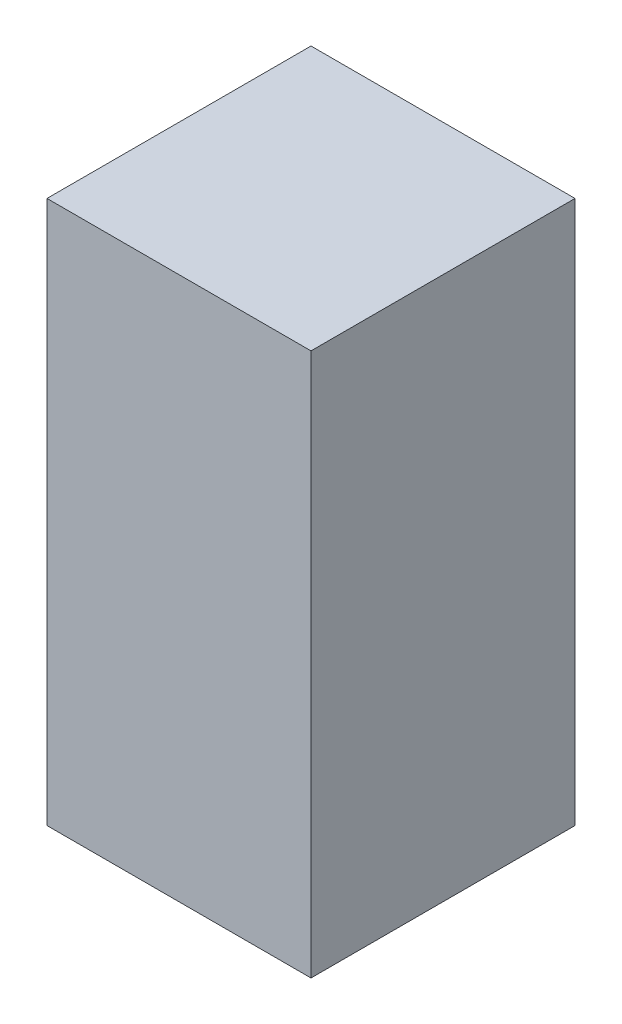
ISO-10303-21;
HEADER;
FILE_DESCRIPTION(('STEP AP214'),'2;1');
FILE_NAME('part.step','',(''),(''),'','','');
FILE_SCHEMA(('AUTOMOTIVE_DESIGN { 1 0 10303 214 1 1 1 1 }'));
ENDSEC;
DATA;
#1=APPLICATION_CONTEXT('core data for automotive mechanical design processes');
#2=APPLICATION_PROTOCOL_DEFINITION('international standard','automotive_design',2000,#1);
#3=PRODUCT_CONTEXT('',#1,'mechanical');
#4=PRODUCT('Part','Part','',(#3));
#5=PRODUCT_RELATED_PRODUCT_CATEGORY('part','',(#4));
#6=PRODUCT_DEFINITION_FORMATION('','',#4);
#7=PRODUCT_DEFINITION_CONTEXT('part definition',#1,'design');
#8=PRODUCT_DEFINITION('design','',#6,#7);
#9=PRODUCT_DEFINITION_SHAPE('','',#8);
#10=(LENGTH_UNIT() NAMED_UNIT(*) SI_UNIT(.MILLI.,.METRE.));
#11=(NAMED_UNIT(*) PLANE_ANGLE_UNIT() SI_UNIT($,.RADIAN.));
#12=(NAMED_UNIT(*) SI_UNIT($,.STERADIAN.) SOLID_ANGLE_UNIT());
#13=UNCERTAINTY_MEASURE_WITH_UNIT(LENGTH_MEASURE(1.E-05),#10,'distance_accuracy_value','');
#14=(GEOMETRIC_REPRESENTATION_CONTEXT(3) GLOBAL_UNCERTAINTY_ASSIGNED_CONTEXT((#13)) GLOBAL_UNIT_ASSIGNED_CONTEXT((#10,
#11,#12)) REPRESENTATION_CONTEXT('',''));
#15=CARTESIAN_POINT('',(0.,0.,0.));
#16=DIRECTION('',(0.,0.,1.));
#17=DIRECTION('',(1.,0.,0.));
#18=AXIS2_PLACEMENT_3D('',#15,#16,#17);
#19=CARTESIAN_POINT('',(-17.5,-36.,35.));
#20=DIRECTION('',(1.,0.,0.));
#21=DIRECTION('',(0.,0.,-1.));
#22=AXIS2_PLACEMENT_3D('',#19,#20,#21);
#23=PLANE('',#22);
#24=DIRECTION('',(0.,-1.,0.));
#25=VECTOR('',#24,1.);
#26=CARTESIAN_POINT('',(-17.5,-36.,0.));
#27=LINE('',#26,#25);
#28=CARTESIAN_POINT('',(-17.5,36.,0.));
#29=VERTEX_POINT('',#28);
#30=CARTESIAN_POINT('',(-17.5,-36.,0.));
#31=VERTEX_POINT('',#30);
#32=EDGE_CURVE('E96',#29,#31,#27,.T.);
#33=ORIENTED_EDGE('',*,*,#32,.T.);
#34=DIRECTION('',(0.,0.,-1.));
#35=VECTOR('',#34,1.);
#36=CARTESIAN_POINT('',(-17.5,-36.,35.));
#37=LINE('',#36,#35);
#38=CARTESIAN_POINT('',(-17.5,-36.,35.));
#39=VERTEX_POINT('',#38);
#40=EDGE_CURVE('E11',#39,#31,#37,.T.);
#41=ORIENTED_EDGE('',*,*,#40,.F.);
#42=DIRECTION('',(0.,-1.,0.));
#43=VECTOR('',#42,1.);
#44=CARTESIAN_POINT('',(-17.5,-36.,35.));
#45=LINE('',#44,#43);
#46=CARTESIAN_POINT('',(-17.5,36.,35.));
#47=VERTEX_POINT('',#46);
#48=EDGE_CURVE('E84',#47,#39,#45,.T.);
#49=ORIENTED_EDGE('',*,*,#48,.F.);
#50=DIRECTION('',(0.,0.,-1.));
#51=VECTOR('',#50,1.);
#52=CARTESIAN_POINT('',(-17.5,36.,35.));
#53=LINE('',#52,#51);
#54=EDGE_CURVE('E92',#47,#29,#53,.T.);
#55=ORIENTED_EDGE('',*,*,#54,.T.);
#56=EDGE_LOOP('',(#33,#41,#49,#55));
#57=FACE_BOUND('',#56,.T.);
#58=ADVANCED_FACE('F33',(#57),#23,.F.);
#59=CARTESIAN_POINT('',(17.5,-36.,35.));
#60=DIRECTION('',(0.,1.,0.));
#61=DIRECTION('',(-1.,0.,0.));
#62=AXIS2_PLACEMENT_3D('',#59,#60,#61);
#63=PLANE('',#62);
#64=DIRECTION('',(1.,0.,0.));
#65=VECTOR('',#64,1.);
#66=CARTESIAN_POINT('',(17.5,-36.,0.));
#67=LINE('',#66,#65);
#68=CARTESIAN_POINT('',(17.5,-36.,0.));
#69=VERTEX_POINT('',#68);
#70=EDGE_CURVE('E88',#31,#69,#67,.T.);
#71=ORIENTED_EDGE('',*,*,#70,.T.);
#72=DIRECTION('',(0.,0.,-1.));
#73=VECTOR('',#72,1.);
#74=CARTESIAN_POINT('',(17.5,-36.,35.));
#75=LINE('',#74,#73);
#76=CARTESIAN_POINT('',(17.5,-36.,35.));
#77=VERTEX_POINT('',#76);
#78=EDGE_CURVE('E41',#77,#69,#75,.T.);
#79=ORIENTED_EDGE('',*,*,#78,.F.);
#80=DIRECTION('',(1.,0.,0.));
#81=VECTOR('',#80,1.);
#82=CARTESIAN_POINT('',(17.5,-36.,35.));
#83=LINE('',#82,#81);
#84=EDGE_CURVE('E79',#39,#77,#83,.T.);
#85=ORIENTED_EDGE('',*,*,#84,.F.);
#86=ORIENTED_EDGE('',*,*,#40,.T.);
#87=EDGE_LOOP('',(#71,#79,#85,#86));
#88=FACE_BOUND('',#87,.T.);
#89=ADVANCED_FACE('F87',(#88),#63,.F.);
#90=CARTESIAN_POINT('',(17.5,-36.,35.));
#91=DIRECTION('',(-1.,0.,0.));
#92=DIRECTION('',(0.,-1.,0.));
#93=AXIS2_PLACEMENT_3D('',#90,#91,#92);
#94=PLANE('',#93);
#95=DIRECTION('',(0.,1.,0.));
#96=VECTOR('',#95,1.);
#97=CARTESIAN_POINT('',(17.5,-36.,0.));
#98=LINE('',#97,#96);
#99=CARTESIAN_POINT('',(17.5,36.,0.));
#100=VERTEX_POINT('',#99);
#101=EDGE_CURVE('E66',#69,#100,#98,.T.);
#102=ORIENTED_EDGE('',*,*,#101,.T.);
#103=DIRECTION('',(0.,0.,-1.));
#104=VECTOR('',#103,1.);
#105=CARTESIAN_POINT('',(17.5,36.,35.));
#106=LINE('',#105,#104);
#107=CARTESIAN_POINT('',(17.5,36.,35.));
#108=VERTEX_POINT('',#107);
#109=EDGE_CURVE('E89',#108,#100,#106,.T.);
#110=ORIENTED_EDGE('',*,*,#109,.F.);
#111=DIRECTION('',(0.,1.,0.));
#112=VECTOR('',#111,1.);
#113=CARTESIAN_POINT('',(17.5,-36.,35.));
#114=LINE('',#113,#112);
#115=EDGE_CURVE('E82',#77,#108,#114,.T.);
#116=ORIENTED_EDGE('',*,*,#115,.F.);
#117=ORIENTED_EDGE('',*,*,#78,.T.);
#118=EDGE_LOOP('',(#102,#110,#116,#117));
#119=FACE_BOUND('',#118,.T.);
#120=ADVANCED_FACE('F90',(#119),#94,.F.);
#121=CARTESIAN_POINT('',(17.5,36.,35.));
#122=DIRECTION('',(0.,-1.,0.));
#123=DIRECTION('',(1.,0.,0.));
#124=AXIS2_PLACEMENT_3D('',#121,#122,#123);
#125=PLANE('',#124);
#126=DIRECTION('',(-1.,0.,0.));
#127=VECTOR('',#126,1.);
#128=CARTESIAN_POINT('',(17.5,36.,0.));
#129=LINE('',#128,#127);
#130=EDGE_CURVE('E72',#100,#29,#129,.T.);
#131=ORIENTED_EDGE('',*,*,#130,.T.);
#132=ORIENTED_EDGE('',*,*,#54,.F.);
#133=DIRECTION('',(-1.,0.,0.));
#134=VECTOR('',#133,1.);
#135=CARTESIAN_POINT('',(17.5,36.,35.));
#136=LINE('',#135,#134);
#137=EDGE_CURVE('E49',#108,#47,#136,.T.);
#138=ORIENTED_EDGE('',*,*,#137,.F.);
#139=ORIENTED_EDGE('',*,*,#109,.T.);
#140=EDGE_LOOP('',(#131,#132,#138,#139));
#141=FACE_BOUND('',#140,.T.);
#142=ADVANCED_FACE('F103',(#141),#125,.F.);
#143=CARTESIAN_POINT('',(0.,0.,35.));
#144=DIRECTION('',(0.,0.,1.));
#145=DIRECTION('',(1.,0.,0.));
#146=AXIS2_PLACEMENT_3D('',#143,#144,#145);
#147=PLANE('',#146);
#148=ORIENTED_EDGE('',*,*,#48,.T.);
#149=ORIENTED_EDGE('',*,*,#84,.T.);
#150=ORIENTED_EDGE('',*,*,#115,.T.);
#151=ORIENTED_EDGE('',*,*,#137,.T.);
#152=EDGE_LOOP('',(#148,#149,#150,#151));
#153=FACE_BOUND('',#152,.T.);
#154=ADVANCED_FACE('F80',(#153),#147,.T.);
#155=CARTESIAN_POINT('',(0.,0.,0.));
#156=DIRECTION('',(0.,0.,1.));
#157=DIRECTION('',(1.,0.,0.));
#158=AXIS2_PLACEMENT_3D('',#155,#156,#157);
#159=PLANE('',#158);
#160=ORIENTED_EDGE('',*,*,#32,.F.);
#161=ORIENTED_EDGE('',*,*,#130,.F.);
#162=ORIENTED_EDGE('',*,*,#101,.F.);
#163=ORIENTED_EDGE('',*,*,#70,.F.);
#164=EDGE_LOOP('',(#160,#161,#162,#163));
#165=FACE_BOUND('',#164,.T.);
#166=ADVANCED_FACE('F106',(#165),#159,.F.);
#167=CLOSED_SHELL('',(#58,#89,#120,#142,#154,#166));
#168=MANIFOLD_SOLID_BREP('B2',#167);
#169=ADVANCED_BREP_SHAPE_REPRESENTATION('',(#18,#168),#14);
#170=SHAPE_DEFINITION_REPRESENTATION(#9,#169);
ENDSEC;
END-ISO-10303-21;
